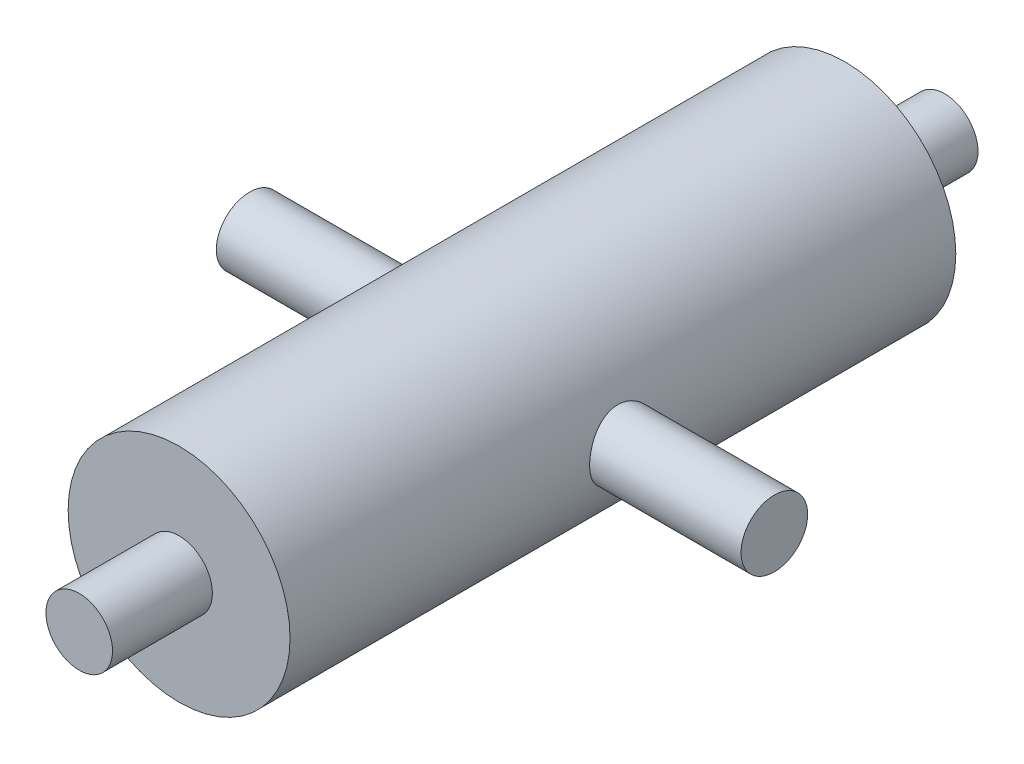
ISO-10303-21;
HEADER;
FILE_DESCRIPTION(('STEP AP214'),'2;1');
FILE_NAME('part.step','',(''),(''),'','','');
FILE_SCHEMA(('AUTOMOTIVE_DESIGN { 1 0 10303 214 1 1 1 1 }'));
ENDSEC;
DATA;
#1=APPLICATION_CONTEXT('core data for automotive mechanical design processes');
#2=APPLICATION_PROTOCOL_DEFINITION('international standard','automotive_design',2000,#1);
#3=PRODUCT_CONTEXT('',#1,'mechanical');
#4=PRODUCT('Part','Part','',(#3));
#5=PRODUCT_RELATED_PRODUCT_CATEGORY('part','',(#4));
#6=PRODUCT_DEFINITION_FORMATION('','',#4);
#7=PRODUCT_DEFINITION_CONTEXT('part definition',#1,'design');
#8=PRODUCT_DEFINITION('design','',#6,#7);
#9=PRODUCT_DEFINITION_SHAPE('','',#8);
#10=(LENGTH_UNIT() NAMED_UNIT(*) SI_UNIT(.MILLI.,.METRE.));
#11=(NAMED_UNIT(*) PLANE_ANGLE_UNIT() SI_UNIT($,.RADIAN.));
#12=(NAMED_UNIT(*) SI_UNIT($,.STERADIAN.) SOLID_ANGLE_UNIT());
#13=UNCERTAINTY_MEASURE_WITH_UNIT(LENGTH_MEASURE(1.E-05),#10,'distance_accuracy_value','');
#14=(GEOMETRIC_REPRESENTATION_CONTEXT(3) GLOBAL_UNCERTAINTY_ASSIGNED_CONTEXT((#13)) GLOBAL_UNIT_ASSIGNED_CONTEXT((#10,
#11,#12)) REPRESENTATION_CONTEXT('',''));
#15=CARTESIAN_POINT('',(0.,0.,0.));
#16=DIRECTION('',(0.,0.,1.));
#17=DIRECTION('',(1.,0.,0.));
#18=AXIS2_PLACEMENT_3D('',#15,#16,#17);
#19=CARTESIAN_POINT('',(0.,0.,60.));
#20=DIRECTION('',(0.,0.,-1.));
#21=DIRECTION('',(-1.,0.,0.));
#22=AXIS2_PLACEMENT_3D('',#19,#20,#21);
#23=CYLINDRICAL_SURFACE('',#22,10.);
#24=CARTESIAN_POINT('',(0.,0.,60.));
#25=DIRECTION('',(0.,0.,1.));
#26=DIRECTION('',(1.,0.,0.));
#27=AXIS2_PLACEMENT_3D('',#24,#25,#26);
#28=CIRCLE('',#27,10.);
#29=CARTESIAN_POINT('',(10.,0.,60.));
#30=VERTEX_POINT('',#29);
#31=EDGE_CURVE('E66',#30,#30,#28,.T.);
#32=ORIENTED_EDGE('',*,*,#31,.F.);
#33=EDGE_LOOP('',(#32));
#34=FACE_BOUND('',#33,.T.);
#35=CARTESIAN_POINT('',(0.,0.,0.));
#36=DIRECTION('',(0.,0.,1.));
#37=DIRECTION('',(1.,0.,0.));
#38=AXIS2_PLACEMENT_3D('',#35,#36,#37);
#39=CIRCLE('',#38,10.);
#40=CARTESIAN_POINT('',(10.,0.,0.));
#41=VERTEX_POINT('',#40);
#42=EDGE_CURVE('E61',#41,#41,#39,.T.);
#43=ORIENTED_EDGE('',*,*,#42,.T.);
#44=EDGE_LOOP('',(#43));
#45=FACE_BOUND('',#44,.T.);
#46=CARTESIAN_POINT('',(10.,0.,33.));
#47=CARTESIAN_POINT('',(9.99999858501101,-0.1645772255066,32.9999980050302));
#48=CARTESIAN_POINT('',(9.99589831387907,-0.329174636703059,32.9864122727521));
#49=CARTESIAN_POINT('',(9.97994211187382,-0.653576250609761,32.9325572915558));
#50=CARTESIAN_POINT('',(9.96808386779384,-0.813379008822839,32.8922800839533));
#51=CARTESIAN_POINT('',(9.93791105003673,-1.12346541550905,32.7865079661795));
#52=CARTESIAN_POINT('',(9.91960600500851,-1.27376272879075,32.7210502607621));
#53=CARTESIAN_POINT('',(9.87844218475291,-1.56124836210626,32.5669278138883));
#54=CARTESIAN_POINT('',(9.85558280384133,-1.69843493493934,32.4782599852092));
#55=CARTESIAN_POINT('',(9.80701474385548,-1.95974359436749,32.2775519850547));
#56=CARTESIAN_POINT('',(9.78124767314073,-2.08343614248868,32.1649667482282));
#57=CARTESIAN_POINT('',(9.73011668420884,-2.31049841846647,31.9207815401796));
#58=CARTESIAN_POINT('',(9.70475283449003,-2.41386472654881,31.7891783757501));
#59=CARTESIAN_POINT('',(9.65668227987544,-2.59960075447415,31.5070584939248));
#60=CARTESIAN_POINT('',(9.63404813327749,-2.68144618044427,31.3561830780185));
#61=CARTESIAN_POINT('',(9.59487240788062,-2.81842789549521,31.0420214915394));
#62=CARTESIAN_POINT('',(9.57832936626621,-2.87357059839946,30.8787383121441));
#63=CARTESIAN_POINT('',(9.55381741676868,-2.95403267365303,30.5492194677391));
#64=CARTESIAN_POINT('',(9.54562138649067,-2.98014392469355,30.3831945122721));
#65=CARTESIAN_POINT('',(9.53805579499534,-3.00427461229344,30.0489336875665));
#66=CARTESIAN_POINT('',(9.53868409521142,-3.00230085522157,29.8806983638818));
#67=CARTESIAN_POINT('',(9.54849488135555,-2.97093954399623,29.553232182783));
#68=CARTESIAN_POINT('',(9.55736777198281,-2.94254410525371,29.3938954992755));
#69=CARTESIAN_POINT('',(9.58216712457248,-2.86074840854112,29.0823604274531));
#70=CARTESIAN_POINT('',(9.59809428264701,-2.80734568283282,28.9301627452513));
#71=CARTESIAN_POINT('',(9.63545466149946,-2.67632053307364,28.6347993006785));
#72=CARTESIAN_POINT('',(9.65696032231904,-2.59837633869285,28.4917858320895));
#73=CARTESIAN_POINT('',(9.70301974000129,-2.42070445177367,28.2205359559796));
#74=CARTESIAN_POINT('',(9.72757423493982,-2.32097148005177,28.0923031411724));
#75=CARTESIAN_POINT('',(9.77822022595875,-2.09762581531093,27.848627618476));
#76=CARTESIAN_POINT('',(9.80433308620996,-1.97318981493395,27.7339426719407));
#77=CARTESIAN_POINT('',(9.85424488126517,-1.70652651862793,27.5268920318715));
#78=CARTESIAN_POINT('',(9.8780436703682,-1.56429810372178,27.4345277431711));
#79=CARTESIAN_POINT('',(9.92086320138941,-1.26471007668561,27.2742801550705));
#80=CARTESIAN_POINT('',(9.93985087336628,-1.1072554994959,27.2065649675003));
#81=CARTESIAN_POINT('',(9.97067043664444,-0.782490831207039,27.0988008198007));
#82=CARTESIAN_POINT('',(9.98250432373999,-0.615183503179164,27.058744142935));
#83=CARTESIAN_POINT('',(9.99736729287077,-0.281904485336664,27.0086956442012));
#84=CARTESIAN_POINT('',(10.0006970083558,-0.116100195202374,26.9976768283968));
#85=CARTESIAN_POINT('',(9.99905846483519,0.214999211646766,27.0031383114242));
#86=CARTESIAN_POINT('',(9.99409131355514,0.380294393381561,27.0196149393029));
#87=CARTESIAN_POINT('',(9.97661393974325,0.701807210619393,27.078769222223));
#88=CARTESIAN_POINT('',(9.96427659598829,0.858145545228338,27.1208467751617));
#89=CARTESIAN_POINT('',(9.9334869568307,1.16150927790904,27.2292864655564));
#90=CARTESIAN_POINT('',(9.91503392642188,1.30853355405117,27.2956515220757));
#91=CARTESIAN_POINT('',(9.87339308702631,1.5928743789221,27.4525063309623));
#92=CARTESIAN_POINT('',(9.8501056165928,1.72988765239934,27.543518681896));
#93=CARTESIAN_POINT('',(9.80146937528705,1.9870466159603,27.7464495081056));
#94=CARTESIAN_POINT('',(9.7761200886242,2.10718806471188,27.8583732237753));
#95=CARTESIAN_POINT('',(9.72506343738007,2.33171489102052,28.1047746167387));
#96=CARTESIAN_POINT('',(9.69937650065513,2.43536962463001,28.2399237515436));
#97=CARTESIAN_POINT('',(9.65153030477949,2.61857990144313,28.5262558780269));
#98=CARTESIAN_POINT('',(9.62937095313121,2.69813607658965,28.6774384491158));
#99=CARTESIAN_POINT('',(9.5913437922631,2.83034694254316,28.99106498251));
#100=CARTESIAN_POINT('',(9.57544675673501,2.88312693874021,29.1534523730757));
#101=CARTESIAN_POINT('',(9.55183188739737,2.96043461630306,29.4853759378605));
#102=CARTESIAN_POINT('',(9.54411125069387,2.98497197957849,29.6549096415661));
#103=CARTESIAN_POINT('',(9.53799944941558,3.0044396896993,29.9887230367768));
#104=CARTESIAN_POINT('',(9.53923294700395,3.00056110615887,30.1529273020988));
#105=CARTESIAN_POINT('',(9.54998802392189,2.9661501088861,30.4782282068012));
#106=CARTESIAN_POINT('',(9.55950927135902,2.93561876249408,30.639324970361));
#107=CARTESIAN_POINT('',(9.58551527389243,2.84953777608686,30.9518907982633));
#108=CARTESIAN_POINT('',(9.60191209104934,2.79430351014248,31.1034545747174));
#109=CARTESIAN_POINT('',(9.63980557805265,2.66063014242147,31.3952848776414));
#110=CARTESIAN_POINT('',(9.6613032238508,2.58218659925722,31.5355492352831));
#111=CARTESIAN_POINT('',(9.70795352855338,2.40097527610175,31.8063262330525));
#112=CARTESIAN_POINT('',(9.7332108032858,2.29742552185996,31.9362975225204));
#113=CARTESIAN_POINT('',(9.78402640899066,2.07034869259555,32.1774049966162));
#114=CARTESIAN_POINT('',(9.80958481647543,1.94681643426897,32.2885362789356));
#115=CARTESIAN_POINT('',(9.85901873141573,1.67893152436652,32.4920468245899));
#116=CARTESIAN_POINT('',(9.88282319531421,1.53407577158122,32.5837828937109));
#117=CARTESIAN_POINT('',(9.92521360911553,1.23028274796705,32.7414703398081));
#118=CARTESIAN_POINT('',(9.94380199862114,1.07135210599791,32.807433776549));
#119=CARTESIAN_POINT('',(9.97204349938619,0.761515425310565,32.9057905513055));
#120=CARTESIAN_POINT('',(9.9824405476214,0.611573923908469,32.9410233457665));
#121=CARTESIAN_POINT('',(9.9964188898898,0.307760390461558,32.9881270504832));
#122=CARTESIAN_POINT('',(10.0000013230948,0.153889019716279,33.0000018654096));
#123=CARTESIAN_POINT('',(10.,0.,33.));
#124=B_SPLINE_CURVE_WITH_KNOTS('',3,(#46,#47,#48,#49,#50,#51,#52,#53,#54,#55,#56,#57,#58,#59,
#60,#61,#62,#63,#64,#65,#66,#67,#68,#69,#70,#71,#72,#73,#74,#75,#76,#77,#78,#79,#80,#81,#82,#83,
#84,#85,#86,#87,#88,#89,#90,#91,#92,#93,#94,#95,#96,#97,#98,#99,#100,#101,#102,#103,#104,#105,
#106,#107,#108,#109,#110,#111,#112,#113,#114,#115,#116,#117,#118,#119,#120,#121,#122,#123),
.UNSPECIFIED.,.T.,.F.,(4,2,2,2,2,2,2,2,2,2,2,2,2,2,2,2,2,2,2,2,2,2,2,2,2,2,2,2,2,2,2,2,2,2,2,2,
2,2,4),(0.,0.493166407225221,0.986479929691999,1.47906735260175,1.9717203288254,
2.47711205896383,2.98258874577265,3.49942962008217,4.01614629086447,4.51839378713197,
5.02051956638179,5.50452033395353,5.98856887316002,6.47924852894239,6.97004720317111,
7.48134208096333,7.99266913062143,8.50742093763377,9.02202907057615,9.5181761887709,
10.0142570710065,10.4991349336465,10.9840710918746,11.4802261140582,11.9765056400038,
12.4908080064564,13.0050968850536,13.516956299025,14.0286401892057,14.5190031093854,
15.0093463933232,15.4936008081456,15.9779479511534,16.4799385136898,16.9820594980413,
17.4988599232246,18.0154182319959,18.4766338387004,18.9377723390687),.UNSPECIFIED.);
#125=CARTESIAN_POINT('',(10.,0.,33.));
#126=VERTEX_POINT('',#125);
#127=EDGE_CURVE('E52',#126,#126,#124,.T.);
#128=ORIENTED_EDGE('',*,*,#127,.F.);
#129=EDGE_LOOP('',(#128));
#130=FACE_BOUND('',#129,.T.);
#131=CARTESIAN_POINT('',(-10.,0.,33.));
#132=CARTESIAN_POINT('',(-9.99999858501101,0.1645772255066,32.9999980050302));
#133=CARTESIAN_POINT('',(-9.99589831387907,0.329174636703059,32.9864122727521));
#134=CARTESIAN_POINT('',(-9.97994211187382,0.653576250609761,32.9325572915558));
#135=CARTESIAN_POINT('',(-9.96808386779384,0.813379008822839,32.8922800839533));
#136=CARTESIAN_POINT('',(-9.93791105003673,1.12346541550905,32.7865079661795));
#137=CARTESIAN_POINT('',(-9.91960600500851,1.27376272879075,32.7210502607621));
#138=CARTESIAN_POINT('',(-9.87844218475291,1.56124836210626,32.5669278138883));
#139=CARTESIAN_POINT('',(-9.85558280384133,1.69843493493934,32.4782599852092));
#140=CARTESIAN_POINT('',(-9.80701474385548,1.95974359436749,32.2775519850547));
#141=CARTESIAN_POINT('',(-9.78124767314073,2.08343614248868,32.1649667482282));
#142=CARTESIAN_POINT('',(-9.73011668420884,2.31049841846647,31.9207815401796));
#143=CARTESIAN_POINT('',(-9.70475283449003,2.41386472654881,31.7891783757501));
#144=CARTESIAN_POINT('',(-9.65668227987544,2.59960075447415,31.5070584939248));
#145=CARTESIAN_POINT('',(-9.63404813327749,2.68144618044427,31.3561830780185));
#146=CARTESIAN_POINT('',(-9.59487240788062,2.81842789549521,31.0420214915394));
#147=CARTESIAN_POINT('',(-9.57832936626621,2.87357059839946,30.8787383121441));
#148=CARTESIAN_POINT('',(-9.55381741676868,2.95403267365303,30.5492194677391));
#149=CARTESIAN_POINT('',(-9.54562138649067,2.98014392469355,30.3831945122721));
#150=CARTESIAN_POINT('',(-9.53805579499534,3.00427461229344,30.0489336875665));
#151=CARTESIAN_POINT('',(-9.53868409521142,3.00230085522157,29.8806983638818));
#152=CARTESIAN_POINT('',(-9.54849488135555,2.97093954399623,29.553232182783));
#153=CARTESIAN_POINT('',(-9.55736777198281,2.94254410525371,29.3938954992755));
#154=CARTESIAN_POINT('',(-9.58216712457248,2.86074840854112,29.0823604274531));
#155=CARTESIAN_POINT('',(-9.59809428264701,2.80734568283282,28.9301627452513));
#156=CARTESIAN_POINT('',(-9.63545466149946,2.67632053307364,28.6347993006785));
#157=CARTESIAN_POINT('',(-9.65696032231904,2.59837633869285,28.4917858320895));
#158=CARTESIAN_POINT('',(-9.70301974000129,2.42070445177367,28.2205359559796));
#159=CARTESIAN_POINT('',(-9.72757423493982,2.32097148005177,28.0923031411724));
#160=CARTESIAN_POINT('',(-9.77822022595875,2.09762581531093,27.848627618476));
#161=CARTESIAN_POINT('',(-9.80433308620996,1.97318981493395,27.7339426719407));
#162=CARTESIAN_POINT('',(-9.85424488126517,1.70652651862793,27.5268920318715));
#163=CARTESIAN_POINT('',(-9.8780436703682,1.56429810372178,27.4345277431711));
#164=CARTESIAN_POINT('',(-9.92086320138941,1.26471007668561,27.2742801550705));
#165=CARTESIAN_POINT('',(-9.93985087336628,1.1072554994959,27.2065649675003));
#166=CARTESIAN_POINT('',(-9.97067043664444,0.782490831207039,27.0988008198007));
#167=CARTESIAN_POINT('',(-9.98250432373999,0.615183503179164,27.058744142935));
#168=CARTESIAN_POINT('',(-9.99736729287077,0.281904485336664,27.0086956442012));
#169=CARTESIAN_POINT('',(-10.0006970083558,0.116100195202374,26.9976768283968));
#170=CARTESIAN_POINT('',(-9.99905846483519,-0.214999211646766,27.0031383114242));
#171=CARTESIAN_POINT('',(-9.99409131355514,-0.380294393381561,27.0196149393029));
#172=CARTESIAN_POINT('',(-9.97661393974325,-0.701807210619393,27.078769222223));
#173=CARTESIAN_POINT('',(-9.96427659598829,-0.858145545228338,27.1208467751617));
#174=CARTESIAN_POINT('',(-9.9334869568307,-1.16150927790904,27.2292864655564));
#175=CARTESIAN_POINT('',(-9.91503392642188,-1.30853355405117,27.2956515220757));
#176=CARTESIAN_POINT('',(-9.87339308702631,-1.5928743789221,27.4525063309623));
#177=CARTESIAN_POINT('',(-9.8501056165928,-1.72988765239934,27.543518681896));
#178=CARTESIAN_POINT('',(-9.80146937528705,-1.9870466159603,27.7464495081056));
#179=CARTESIAN_POINT('',(-9.7761200886242,-2.10718806471188,27.8583732237753));
#180=CARTESIAN_POINT('',(-9.72506343738007,-2.33171489102052,28.1047746167387));
#181=CARTESIAN_POINT('',(-9.69937650065513,-2.43536962463001,28.2399237515436));
#182=CARTESIAN_POINT('',(-9.65153030477949,-2.61857990144313,28.5262558780269));
#183=CARTESIAN_POINT('',(-9.62937095313121,-2.69813607658965,28.6774384491158));
#184=CARTESIAN_POINT('',(-9.5913437922631,-2.83034694254316,28.99106498251));
#185=CARTESIAN_POINT('',(-9.57544675673501,-2.88312693874021,29.1534523730757));
#186=CARTESIAN_POINT('',(-9.55183188739737,-2.96043461630306,29.4853759378605));
#187=CARTESIAN_POINT('',(-9.54411125069387,-2.98497197957849,29.6549096415661));
#188=CARTESIAN_POINT('',(-9.53799944941558,-3.0044396896993,29.9887230367768));
#189=CARTESIAN_POINT('',(-9.53923294700395,-3.00056110615887,30.1529273020988));
#190=CARTESIAN_POINT('',(-9.54998802392189,-2.9661501088861,30.4782282068012));
#191=CARTESIAN_POINT('',(-9.55950927135902,-2.93561876249408,30.639324970361));
#192=CARTESIAN_POINT('',(-9.58551527389243,-2.84953777608686,30.9518907982633));
#193=CARTESIAN_POINT('',(-9.60191209104934,-2.79430351014248,31.1034545747174));
#194=CARTESIAN_POINT('',(-9.63980557805265,-2.66063014242147,31.3952848776414));
#195=CARTESIAN_POINT('',(-9.6613032238508,-2.58218659925722,31.5355492352831));
#196=CARTESIAN_POINT('',(-9.70795352855338,-2.40097527610175,31.8063262330525));
#197=CARTESIAN_POINT('',(-9.7332108032858,-2.29742552185996,31.9362975225204));
#198=CARTESIAN_POINT('',(-9.78402640899066,-2.07034869259555,32.1774049966162));
#199=CARTESIAN_POINT('',(-9.80958481647543,-1.94681643426897,32.2885362789356));
#200=CARTESIAN_POINT('',(-9.85901873141573,-1.67893152436652,32.4920468245899));
#201=CARTESIAN_POINT('',(-9.88282319531421,-1.53407577158122,32.5837828937109));
#202=CARTESIAN_POINT('',(-9.92521360911553,-1.23028274796705,32.7414703398081));
#203=CARTESIAN_POINT('',(-9.94380199862114,-1.07135210599791,32.807433776549));
#204=CARTESIAN_POINT('',(-9.97204349938619,-0.761515425310565,32.9057905513055));
#205=CARTESIAN_POINT('',(-9.9824405476214,-0.611573923908469,32.9410233457665));
#206=CARTESIAN_POINT('',(-9.9964188898898,-0.307760390461558,32.9881270504832));
#207=CARTESIAN_POINT('',(-10.0000013230948,-0.153889019716279,33.0000018654096));
#208=CARTESIAN_POINT('',(-10.,0.,33.));
#209=B_SPLINE_CURVE_WITH_KNOTS('',3,(#131,#132,#133,#134,#135,#136,#137,#138,#139,#140,#141,
#142,#143,#144,#145,#146,#147,#148,#149,#150,#151,#152,#153,#154,#155,#156,#157,#158,#159,#160,
#161,#162,#163,#164,#165,#166,#167,#168,#169,#170,#171,#172,#173,#174,#175,#176,#177,#178,#179,
#180,#181,#182,#183,#184,#185,#186,#187,#188,#189,#190,#191,#192,#193,#194,#195,#196,#197,#198,
#199,#200,#201,#202,#203,#204,#205,#206,#207,#208),.UNSPECIFIED.,.T.,.F.,(4,2,2,2,2,2,2,2,2,2,2,
2,2,2,2,2,2,2,2,2,2,2,2,2,2,2,2,2,2,2,2,2,2,2,2,2,2,2,4),(0.,0.493166407225221,
0.986479929691999,1.47906735260175,1.9717203288254,2.47711205896383,2.98258874577265,
3.49942962008217,4.01614629086447,4.51839378713197,5.02051956638179,5.50452033395353,
5.98856887316002,6.47924852894239,6.97004720317111,7.48134208096333,7.99266913062143,
8.50742093763377,9.02202907057615,9.5181761887709,10.0142570710065,10.4991349336465,
10.9840710918746,11.4802261140582,11.9765056400038,12.4908080064564,13.0050968850536,
13.516956299025,14.0286401892057,14.5190031093854,15.0093463933232,15.4936008081456,
15.9779479511534,16.4799385136898,16.9820594980413,17.4988599232246,18.0154182319959,
18.4766338387004,18.9377723390687),.UNSPECIFIED.);
#210=CARTESIAN_POINT('',(-10.,0.,33.));
#211=VERTEX_POINT('',#210);
#212=EDGE_CURVE('E46',#211,#211,#209,.T.);
#213=ORIENTED_EDGE('',*,*,#212,.F.);
#214=EDGE_LOOP('',(#213));
#215=FACE_BOUND('',#214,.T.);
#216=ADVANCED_FACE('F37',(#34,#45,#130,#215),#23,.T.);
#217=CARTESIAN_POINT('',(0.,0.,60.));
#218=DIRECTION('',(0.,0.,1.));
#219=DIRECTION('',(1.,0.,0.));
#220=AXIS2_PLACEMENT_3D('',#217,#218,#219);
#221=PLANE('',#220);
#222=CARTESIAN_POINT('',(0.,0.,60.));
#223=DIRECTION('',(0.,0.,1.));
#224=DIRECTION('',(1.,0.,0.));
#225=AXIS2_PLACEMENT_3D('',#222,#223,#224);
#226=CIRCLE('',#225,3.);
#227=CARTESIAN_POINT('',(3.,0.,60.));
#228=VERTEX_POINT('',#227);
#229=EDGE_CURVE('E10',#228,#228,#226,.T.);
#230=ORIENTED_EDGE('',*,*,#229,.F.);
#231=EDGE_LOOP('',(#230));
#232=FACE_BOUND('',#231,.T.);
#233=ORIENTED_EDGE('',*,*,#31,.T.);
#234=EDGE_LOOP('',(#233));
#235=FACE_BOUND('',#234,.T.);
#236=ADVANCED_FACE('F91',(#232,#235),#221,.T.);
#237=CARTESIAN_POINT('',(0.,0.,0.));
#238=DIRECTION('',(0.,0.,1.));
#239=DIRECTION('',(1.,0.,0.));
#240=AXIS2_PLACEMENT_3D('',#237,#238,#239);
#241=PLANE('',#240);
#242=CARTESIAN_POINT('',(0.,0.,0.));
#243=DIRECTION('',(0.,0.,1.));
#244=DIRECTION('',(1.,0.,0.));
#245=AXIS2_PLACEMENT_3D('',#242,#243,#244);
#246=CIRCLE('',#245,3.);
#247=CARTESIAN_POINT('',(3.,0.,0.));
#248=VERTEX_POINT('',#247);
#249=EDGE_CURVE('E41',#248,#248,#246,.T.);
#250=ORIENTED_EDGE('',*,*,#249,.T.);
#251=EDGE_LOOP('',(#250));
#252=FACE_BOUND('',#251,.T.);
#253=ORIENTED_EDGE('',*,*,#42,.F.);
#254=EDGE_LOOP('',(#253));
#255=FACE_BOUND('',#254,.T.);
#256=ADVANCED_FACE('F94',(#252,#255),#241,.F.);
#257=CARTESIAN_POINT('',(23.645,0.,30.));
#258=DIRECTION('',(1.,0.,0.));
#259=DIRECTION('',(0.,0.,-1.));
#260=AXIS2_PLACEMENT_3D('',#257,#258,#259);
#261=PLANE('',#260);
#262=CARTESIAN_POINT('',(23.645,0.,30.));
#263=DIRECTION('',(1.,0.,0.));
#264=DIRECTION('',(0.,0.,-1.));
#265=AXIS2_PLACEMENT_3D('',#262,#263,#264);
#266=CIRCLE('',#265,3.);
#267=CARTESIAN_POINT('',(23.645,0.,27.));
#268=VERTEX_POINT('',#267);
#269=EDGE_CURVE('E57',#268,#268,#266,.T.);
#270=ORIENTED_EDGE('',*,*,#269,.T.);
#271=EDGE_LOOP('',(#270));
#272=FACE_BOUND('',#271,.T.);
#273=ADVANCED_FACE('F97',(#272),#261,.T.);
#274=CARTESIAN_POINT('',(23.645,0.,30.));
#275=DIRECTION('',(-1.,0.,0.));
#276=DIRECTION('',(0.,0.,1.));
#277=AXIS2_PLACEMENT_3D('',#274,#275,#276);
#278=CYLINDRICAL_SURFACE('',#277,3.);
#279=ORIENTED_EDGE('',*,*,#269,.F.);
#280=EDGE_LOOP('',(#279));
#281=FACE_BOUND('',#280,.T.);
#282=ORIENTED_EDGE('',*,*,#127,.T.);
#283=EDGE_LOOP('',(#282));
#284=FACE_BOUND('',#283,.T.);
#285=ADVANCED_FACE('F88',(#281,#284),#278,.T.);
#286=CARTESIAN_POINT('',(-23.645,0.,30.));
#287=DIRECTION('',(1.,0.,0.));
#288=DIRECTION('',(0.,0.,-1.));
#289=AXIS2_PLACEMENT_3D('',#286,#287,#288);
#290=CIRCLE('',#289,3.);
#291=CARTESIAN_POINT('',(-23.645,0.,27.));
#292=VERTEX_POINT('',#291);
#293=EDGE_CURVE('E62',#292,#292,#290,.T.);
#294=ORIENTED_EDGE('',*,*,#293,.T.);
#295=EDGE_LOOP('',(#294));
#296=FACE_BOUND('',#295,.T.);
#297=ORIENTED_EDGE('',*,*,#212,.T.);
#298=EDGE_LOOP('',(#297));
#299=FACE_BOUND('',#298,.T.);
#300=ADVANCED_FACE('F82',(#296,#299),#278,.T.);
#301=CARTESIAN_POINT('',(-23.645,0.,30.));
#302=DIRECTION('',(1.,0.,0.));
#303=DIRECTION('',(0.,0.,-1.));
#304=AXIS2_PLACEMENT_3D('',#301,#302,#303);
#305=PLANE('',#304);
#306=ORIENTED_EDGE('',*,*,#293,.F.);
#307=EDGE_LOOP('',(#306));
#308=FACE_BOUND('',#307,.T.);
#309=ADVANCED_FACE('F87',(#308),#305,.F.);
#310=CARTESIAN_POINT('',(0.,0.,-9.00000000000001));
#311=DIRECTION('',(0.,0.,1.));
#312=DIRECTION('',(1.,0.,0.));
#313=AXIS2_PLACEMENT_3D('',#310,#311,#312);
#314=PLANE('',#313);
#315=CARTESIAN_POINT('',(0.,0.,-9.00000000000001));
#316=DIRECTION('',(0.,0.,1.));
#317=DIRECTION('',(1.,0.,0.));
#318=AXIS2_PLACEMENT_3D('',#315,#316,#317);
#319=CIRCLE('',#318,3.);
#320=CARTESIAN_POINT('',(3.,0.,-9.00000000000001));
#321=VERTEX_POINT('',#320);
#322=EDGE_CURVE('E55',#321,#321,#319,.T.);
#323=ORIENTED_EDGE('',*,*,#322,.F.);
#324=EDGE_LOOP('',(#323));
#325=FACE_BOUND('',#324,.T.);
#326=ADVANCED_FACE('F137',(#325),#314,.F.);
#327=CARTESIAN_POINT('',(0.,0.,-9.00000000000001));
#328=DIRECTION('',(0.,0.,1.));
#329=DIRECTION('',(1.,0.,0.));
#330=AXIS2_PLACEMENT_3D('',#327,#328,#329);
#331=CYLINDRICAL_SURFACE('',#330,3.);
#332=ORIENTED_EDGE('',*,*,#322,.T.);
#333=EDGE_LOOP('',(#332));
#334=FACE_BOUND('',#333,.T.);
#335=ORIENTED_EDGE('',*,*,#249,.F.);
#336=EDGE_LOOP('',(#335));
#337=FACE_BOUND('',#336,.T.);
#338=ADVANCED_FACE('F143',(#334,#337),#331,.T.);
#339=ORIENTED_EDGE('',*,*,#229,.T.);
#340=EDGE_LOOP('',(#339));
#341=FACE_BOUND('',#340,.T.);
#342=CARTESIAN_POINT('',(0.,0.,69.));
#343=DIRECTION('',(0.,0.,1.));
#344=DIRECTION('',(1.,0.,0.));
#345=AXIS2_PLACEMENT_3D('',#342,#343,#344);
#346=CIRCLE('',#345,3.);
#347=CARTESIAN_POINT('',(3.,0.,69.));
#348=VERTEX_POINT('',#347);
#349=EDGE_CURVE('E201',#348,#348,#346,.T.);
#350=ORIENTED_EDGE('',*,*,#349,.F.);
#351=EDGE_LOOP('',(#350));
#352=FACE_BOUND('',#351,.T.);
#353=ADVANCED_FACE('F151',(#341,#352),#331,.T.);
#354=CARTESIAN_POINT('',(0.,0.,69.));
#355=DIRECTION('',(0.,0.,1.));
#356=DIRECTION('',(1.,0.,0.));
#357=AXIS2_PLACEMENT_3D('',#354,#355,#356);
#358=PLANE('',#357);
#359=ORIENTED_EDGE('',*,*,#349,.T.);
#360=EDGE_LOOP('',(#359));
#361=FACE_BOUND('',#360,.T.);
#362=ADVANCED_FACE('F159',(#361),#358,.T.);
#363=CLOSED_SHELL('',(#216,#236,#256,#273,#285,#300,#309,#326,#338,#353,#362));
#364=MANIFOLD_SOLID_BREP('B2',#363);
#365=ADVANCED_BREP_SHAPE_REPRESENTATION('',(#18,#364),#14);
#366=SHAPE_DEFINITION_REPRESENTATION(#9,#365);
ENDSEC;
END-ISO-10303-21;
